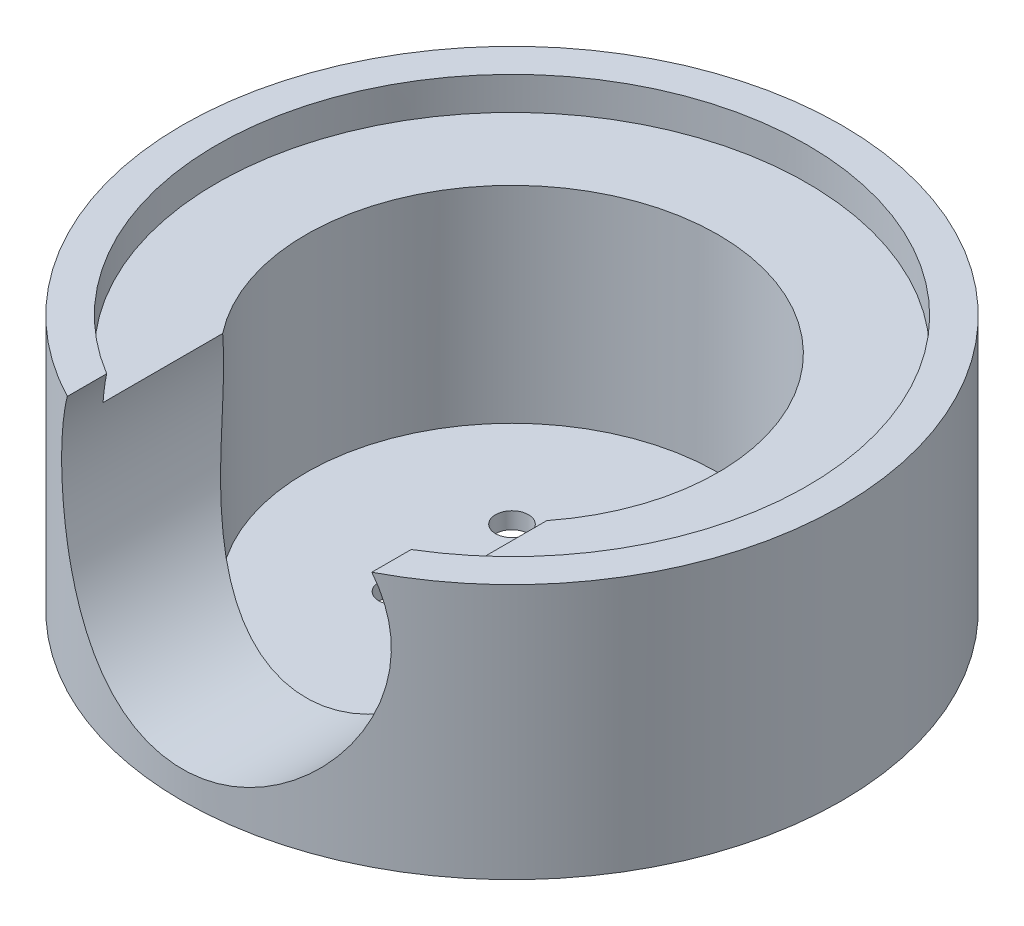
ISO-10303-21;
HEADER;
FILE_DESCRIPTION(('STEP AP214'),'2;1');
FILE_NAME('part.step','',(''),(''),'','','');
FILE_SCHEMA(('AUTOMOTIVE_DESIGN { 1 0 10303 214 1 1 1 1 }'));
ENDSEC;
DATA;
#1=APPLICATION_CONTEXT('core data for automotive mechanical design processes');
#2=APPLICATION_PROTOCOL_DEFINITION('international standard','automotive_design',2000,#1);
#3=PRODUCT_CONTEXT('',#1,'mechanical');
#4=PRODUCT('Part','Part','',(#3));
#5=PRODUCT_RELATED_PRODUCT_CATEGORY('part','',(#4));
#6=PRODUCT_DEFINITION_FORMATION('','',#4);
#7=PRODUCT_DEFINITION_CONTEXT('part definition',#1,'design');
#8=PRODUCT_DEFINITION('design','',#6,#7);
#9=PRODUCT_DEFINITION_SHAPE('','',#8);
#10=(LENGTH_UNIT() NAMED_UNIT(*) SI_UNIT(.MILLI.,.METRE.));
#11=(NAMED_UNIT(*) PLANE_ANGLE_UNIT() SI_UNIT($,.RADIAN.));
#12=(NAMED_UNIT(*) SI_UNIT($,.STERADIAN.) SOLID_ANGLE_UNIT());
#13=UNCERTAINTY_MEASURE_WITH_UNIT(LENGTH_MEASURE(1.E-05),#10,'distance_accuracy_value','');
#14=(GEOMETRIC_REPRESENTATION_CONTEXT(3) GLOBAL_UNCERTAINTY_ASSIGNED_CONTEXT((#13)) GLOBAL_UNIT_ASSIGNED_CONTEXT((#10,
#11,#12)) REPRESENTATION_CONTEXT('',''));
#15=CARTESIAN_POINT('',(0.,0.,0.));
#16=DIRECTION('',(0.,0.,1.));
#17=DIRECTION('',(1.,0.,0.));
#18=AXIS2_PLACEMENT_3D('',#15,#16,#17);
#19=CARTESIAN_POINT('',(0.,0.,0.));
#20=DIRECTION('',(0.,1.,0.));
#21=DIRECTION('',(0.,0.,1.));
#22=AXIS2_PLACEMENT_3D('',#19,#20,#21);
#23=PLANE('',#22);
#24=CARTESIAN_POINT('',(-4.24264068711928,0.,4.24264068711928));
#25=DIRECTION('',(0.,1.,0.));
#26=DIRECTION('',(0.,0.,1.));
#27=AXIS2_PLACEMENT_3D('',#24,#25,#26);
#28=CIRCLE('',#27,1.2);
#29=CARTESIAN_POINT('',(-4.24264068711928,0.,5.44264068711928));
#30=VERTEX_POINT('',#29);
#31=EDGE_CURVE('E123',#30,#30,#28,.T.);
#32=ORIENTED_EDGE('',*,*,#31,.T.);
#33=EDGE_LOOP('',(#32));
#34=FACE_BOUND('',#33,.T.);
#35=CARTESIAN_POINT('',(4.24264068711928,0.,4.24264068711928));
#36=DIRECTION('',(0.,1.,0.));
#37=DIRECTION('',(0.,0.,1.));
#38=AXIS2_PLACEMENT_3D('',#35,#36,#37);
#39=CIRCLE('',#38,1.2);
#40=CARTESIAN_POINT('',(4.24264068711928,0.,5.44264068711928));
#41=VERTEX_POINT('',#40);
#42=EDGE_CURVE('E128',#41,#41,#39,.T.);
#43=ORIENTED_EDGE('',*,*,#42,.T.);
#44=EDGE_LOOP('',(#43));
#45=FACE_BOUND('',#44,.T.);
#46=CARTESIAN_POINT('',(-4.24264068711928,0.,-4.24264068711928));
#47=DIRECTION('',(0.,1.,0.));
#48=DIRECTION('',(0.,0.,1.));
#49=AXIS2_PLACEMENT_3D('',#46,#47,#48);
#50=CIRCLE('',#49,1.2);
#51=CARTESIAN_POINT('',(-4.24264068711928,0.,-3.04264068711929));
#52=VERTEX_POINT('',#51);
#53=EDGE_CURVE('E139',#52,#52,#50,.T.);
#54=ORIENTED_EDGE('',*,*,#53,.T.);
#55=EDGE_LOOP('',(#54));
#56=FACE_BOUND('',#55,.T.);
#57=CARTESIAN_POINT('',(4.24264068711928,0.,-4.24264068711928));
#58=DIRECTION('',(0.,1.,0.));
#59=DIRECTION('',(0.,0.,1.));
#60=AXIS2_PLACEMENT_3D('',#57,#58,#59);
#61=CIRCLE('',#60,1.2);
#62=CARTESIAN_POINT('',(4.24264068711928,0.,-3.04264068711929));
#63=VERTEX_POINT('',#62);
#64=EDGE_CURVE('E147',#63,#63,#61,.T.);
#65=ORIENTED_EDGE('',*,*,#64,.T.);
#66=EDGE_LOOP('',(#65));
#67=FACE_BOUND('',#66,.T.);
#68=CARTESIAN_POINT('',(0.,0.,0.));
#69=DIRECTION('',(0.,-1.,0.));
#70=DIRECTION('',(0.,0.,-1.));
#71=AXIS2_PLACEMENT_3D('',#68,#69,#70);
#72=CIRCLE('',#71,19.);
#73=CARTESIAN_POINT('',(0.,0.,-19.));
#74=VERTEX_POINT('',#73);
#75=EDGE_CURVE('E249',#74,#74,#72,.T.);
#76=ORIENTED_EDGE('',*,*,#75,.T.);
#77=EDGE_LOOP('',(#76));
#78=FACE_BOUND('',#77,.T.);
#79=ADVANCED_FACE('F44',(#34,#45,#56,#67,#78),#23,.F.);
#80=CARTESIAN_POINT('',(0.,16.2,0.));
#81=DIRECTION('',(0.,1.,0.));
#82=DIRECTION('',(0.,0.,1.));
#83=AXIS2_PLACEMENT_3D('',#80,#81,#82);
#84=PLANE('',#83);
#85=DIRECTION('',(0.,0.,1.));
#86=VECTOR('',#85,1.);
#87=CARTESIAN_POINT('',(-11.7966096824469,16.2,4.));
#88=LINE('',#87,#86);
#89=CARTESIAN_POINT('',(-11.7966096824469,16.2,9.26498785752037));
#90=VERTEX_POINT('',#89);
#91=CARTESIAN_POINT('',(-11.7966096824469,16.2,17.9747044481961));
#92=VERTEX_POINT('',#91);
#93=EDGE_CURVE('E70',#90,#92,#88,.T.);
#94=ORIENTED_EDGE('',*,*,#93,.F.);
#95=CARTESIAN_POINT('',(0.,16.2,0.));
#96=DIRECTION('',(0.,1.,0.));
#97=DIRECTION('',(0.,0.,1.));
#98=AXIS2_PLACEMENT_3D('',#95,#96,#97);
#99=CIRCLE('',#98,15.);
#100=CARTESIAN_POINT('',(11.7966096824469,16.2,9.26498785752037));
#101=VERTEX_POINT('',#100);
#102=EDGE_CURVE('E116',#101,#90,#99,.T.);
#103=ORIENTED_EDGE('',*,*,#102,.F.);
#104=DIRECTION('',(0.,0.,1.));
#105=VECTOR('',#104,1.);
#106=CARTESIAN_POINT('',(11.7966096824469,16.2,4.));
#107=LINE('',#106,#105);
#108=CARTESIAN_POINT('',(11.7966096824469,16.2,17.9747044481961));
#109=VERTEX_POINT('',#108);
#110=EDGE_CURVE('E115',#109,#101,#107,.F.);
#111=ORIENTED_EDGE('',*,*,#110,.F.);
#112=CARTESIAN_POINT('',(0.,16.2,0.));
#113=DIRECTION('',(0.,1.,0.));
#114=DIRECTION('',(0.,0.,1.));
#115=AXIS2_PLACEMENT_3D('',#112,#113,#114);
#116=CIRCLE('',#115,21.5);
#117=EDGE_CURVE('E96',#92,#109,#116,.F.);
#118=ORIENTED_EDGE('',*,*,#117,.F.);
#119=EDGE_LOOP('',(#94,#103,#111,#118));
#120=FACE_BOUND('',#119,.T.);
#121=ADVANCED_FACE('F201',(#120),#84,.T.);
#122=CARTESIAN_POINT('',(0.,1.2,0.));
#123=DIRECTION('',(0.,1.,0.));
#124=DIRECTION('',(0.,0.,1.));
#125=AXIS2_PLACEMENT_3D('',#122,#123,#124);
#126=PLANE('',#125);
#127=CARTESIAN_POINT('',(-4.24264068711928,1.2,4.24264068711928));
#128=DIRECTION('',(0.,1.,0.));
#129=DIRECTION('',(0.,0.,1.));
#130=AXIS2_PLACEMENT_3D('',#127,#128,#129);
#131=CIRCLE('',#130,1.2);
#132=CARTESIAN_POINT('',(-4.24264068711928,1.2,5.44264068711928));
#133=VERTEX_POINT('',#132);
#134=EDGE_CURVE('E127',#133,#133,#131,.T.);
#135=ORIENTED_EDGE('',*,*,#134,.F.);
#136=EDGE_LOOP('',(#135));
#137=FACE_BOUND('',#136,.T.);
#138=CARTESIAN_POINT('',(-4.24264068711928,1.2,-4.24264068711928));
#139=DIRECTION('',(0.,1.,0.));
#140=DIRECTION('',(0.,0.,1.));
#141=AXIS2_PLACEMENT_3D('',#138,#139,#140);
#142=CIRCLE('',#141,1.2);
#143=CARTESIAN_POINT('',(-4.24264068711928,1.2,-3.04264068711929));
#144=VERTEX_POINT('',#143);
#145=EDGE_CURVE('E145',#144,#144,#142,.T.);
#146=ORIENTED_EDGE('',*,*,#145,.F.);
#147=EDGE_LOOP('',(#146));
#148=FACE_BOUND('',#147,.T.);
#149=CARTESIAN_POINT('',(4.24264068711928,1.2,-4.24264068711928));
#150=DIRECTION('',(0.,1.,0.));
#151=DIRECTION('',(0.,0.,1.));
#152=AXIS2_PLACEMENT_3D('',#149,#150,#151);
#153=CIRCLE('',#152,1.2);
#154=CARTESIAN_POINT('',(4.24264068711928,1.2,-3.04264068711929));
#155=VERTEX_POINT('',#154);
#156=EDGE_CURVE('E148',#155,#155,#153,.T.);
#157=ORIENTED_EDGE('',*,*,#156,.F.);
#158=EDGE_LOOP('',(#157));
#159=FACE_BOUND('',#158,.T.);
#160=CARTESIAN_POINT('',(4.24264068711928,1.2,4.24264068711928));
#161=DIRECTION('',(0.,1.,0.));
#162=DIRECTION('',(0.,0.,1.));
#163=AXIS2_PLACEMENT_3D('',#160,#161,#162);
#164=CIRCLE('',#163,1.2);
#165=CARTESIAN_POINT('',(4.24264068711928,1.2,5.44264068711928));
#166=VERTEX_POINT('',#165);
#167=EDGE_CURVE('E133',#166,#166,#164,.T.);
#168=ORIENTED_EDGE('',*,*,#167,.F.);
#169=EDGE_LOOP('',(#168));
#170=FACE_BOUND('',#169,.T.);
#171=CARTESIAN_POINT('',(0.,1.2,0.));
#172=DIRECTION('',(0.,1.,0.));
#173=DIRECTION('',(0.,0.,1.));
#174=AXIS2_PLACEMENT_3D('',#171,#172,#173);
#175=CIRCLE('',#174,15.);
#176=CARTESIAN_POINT('',(0.,1.2,15.));
#177=VERTEX_POINT('',#176);
#178=EDGE_CURVE('E163',#177,#177,#175,.F.);
#179=ORIENTED_EDGE('',*,*,#178,.F.);
#180=EDGE_LOOP('',(#179));
#181=FACE_BOUND('',#180,.T.);
#182=ADVANCED_FACE('F210',(#137,#148,#159,#170,#181),#126,.T.);
#183=CARTESIAN_POINT('',(0.,0.,0.));
#184=DIRECTION('',(0.,-1.,0.));
#185=DIRECTION('',(0.,0.,-1.));
#186=AXIS2_PLACEMENT_3D('',#183,#184,#185);
#187=CIRCLE('',#186,20.);
#188=CARTESIAN_POINT('',(0.,0.,-20.));
#189=VERTEX_POINT('',#188);
#190=EDGE_CURVE('E260',#189,#189,#187,.T.);
#191=ORIENTED_EDGE('',*,*,#190,.F.);
#192=EDGE_LOOP('',(#191));
#193=FACE_BOUND('',#192,.T.);
#194=CARTESIAN_POINT('',(0.,0.,0.));
#195=DIRECTION('',(0.,1.,0.));
#196=DIRECTION('',(0.,0.,1.));
#197=AXIS2_PLACEMENT_3D('',#194,#195,#196);
#198=CIRCLE('',#197,24.);
#199=CARTESIAN_POINT('',(0.,0.,24.));
#200=VERTEX_POINT('',#199);
#201=EDGE_CURVE('E153',#200,#200,#198,.T.);
#202=ORIENTED_EDGE('',*,*,#201,.F.);
#203=EDGE_LOOP('',(#202));
#204=FACE_BOUND('',#203,.T.);
#205=ADVANCED_FACE('F223',(#193,#204),#23,.F.);
#206=CARTESIAN_POINT('',(0.,1.2,0.));
#207=DIRECTION('',(0.,-1.,0.));
#208=DIRECTION('',(0.,0.,-1.));
#209=AXIS2_PLACEMENT_3D('',#206,#207,#208);
#210=CYLINDRICAL_SURFACE('',#209,24.);
#211=ORIENTED_EDGE('',*,*,#201,.T.);
#212=EDGE_LOOP('',(#211));
#213=FACE_BOUND('',#212,.T.);
#214=CARTESIAN_POINT('',(0.,18.6,0.));
#215=DIRECTION('',(0.,1.,0.));
#216=DIRECTION('',(0.,0.,1.));
#217=AXIS2_PLACEMENT_3D('',#214,#215,#216);
#218=CIRCLE('',#217,24.);
#219=CARTESIAN_POINT('',(11.0833208019979,18.6,21.2875550498407));
#220=VERTEX_POINT('',#219);
#221=CARTESIAN_POINT('',(-11.0833208019979,18.6,21.2875550498407));
#222=VERTEX_POINT('',#221);
#223=EDGE_CURVE('E102',#220,#222,#218,.T.);
#224=ORIENTED_EDGE('',*,*,#223,.F.);
#225=CARTESIAN_POINT('',(11.0833208019979,18.6,21.2875550498407));
#226=CARTESIAN_POINT('',(11.1970244557131,18.3261122643757,21.2283322597258));
#227=CARTESIAN_POINT('',(11.3008579055262,18.0471859478185,21.1731345702951));
#228=CARTESIAN_POINT('',(11.487971481082,17.4807125003222,21.0722113917843));
#229=CARTESIAN_POINT('',(11.5712417435088,17.1931613062549,21.0264904499932));
#230=CARTESIAN_POINT('',(11.7162845177026,16.6112439711941,20.946013891137));
#231=CARTESIAN_POINT('',(11.7780632453862,16.3168798269986,20.9112551038011));
#232=CARTESIAN_POINT('',(11.8794400638934,15.7232361591465,20.8538324366272));
#233=CARTESIAN_POINT('',(11.9190422341114,15.423957549942,20.8311663323673));
#234=CARTESIAN_POINT('',(11.9756741437059,14.821600315694,20.7986610665074));
#235=CARTESIAN_POINT('',(11.9926312724159,14.5185125974126,20.788863168086));
#236=CARTESIAN_POINT('',(12.0035113301073,13.911766613792,20.7825830445358));
#237=CARTESIAN_POINT('',(11.9974328942063,13.6081083157108,20.786101608422));
#238=CARTESIAN_POINT('',(11.9623381685398,13.0028737906318,20.8063180210309));
#239=CARTESIAN_POINT('',(11.9333448922832,12.7012957807531,20.823002646974));
#240=CARTESIAN_POINT('',(11.852828812059,12.1021528734258,20.8689383071883));
#241=CARTESIAN_POINT('',(11.801306473882,11.8045878931387,20.898189081653));
#242=CARTESIAN_POINT('',(11.6781869892019,11.2241481409339,20.9672309181471));
#243=CARTESIAN_POINT('',(11.6072239017473,10.9410985985102,21.0066871702643));
#244=CARTESIAN_POINT('',(11.4453796452044,10.3822652899988,21.0953017340055));
#245=CARTESIAN_POINT('',(11.3544915137956,10.1064841014881,21.1444634363635));
#246=CARTESIAN_POINT('',(11.0530511788569,9.29203094542062,21.3045086863495));
#247=CARTESIAN_POINT('',(10.8137173185586,8.76622282023769,21.4279557452925));
#248=CARTESIAN_POINT('',(10.2393332164356,7.71110326752024,21.70868508706));
#249=CARTESIAN_POINT('',(9.89740252879308,7.18610454892774,21.8680566542023));
#250=CARTESIAN_POINT('',(9.32822221708918,6.44476472247295,22.1139588458477));
#251=CARTESIAN_POINT('',(9.12899266016922,6.20522833336016,22.1971135236028));
#252=CARTESIAN_POINT('',(8.7125279683947,5.74235310606471,22.3638575345806));
#253=CARTESIAN_POINT('',(8.49529013973564,5.51901670059292,22.4474469310725));
#254=CARTESIAN_POINT('',(8.01925237345074,5.06630452022484,22.6221722030942));
#255=CARTESIAN_POINT('',(7.75850165628553,4.83891269008451,22.7131403269385));
#256=CARTESIAN_POINT('',(7.21753314828806,4.40693092909676,22.8907891260391));
#257=CARTESIAN_POINT('',(6.93732220289053,4.20233304542051,22.9774712907626));
#258=CARTESIAN_POINT('',(6.35877756326696,3.81733334816318,23.1442560300259));
#259=CARTESIAN_POINT('',(6.06043993239415,3.63693681797511,23.224357166388));
#260=CARTESIAN_POINT('',(5.4474481129274,3.30199690467356,23.3757341719309));
#261=CARTESIAN_POINT('',(5.13279488607168,3.14745199997584,23.4470105604576));
#262=CARTESIAN_POINT('',(4.496897733423,2.86916585712556,23.5771224110577));
#263=CARTESIAN_POINT('',(4.17598948415711,2.74477839574151,23.6362138389508));
#264=CARTESIAN_POINT('',(3.52284704058958,2.52357150653168,23.7423458285371));
#265=CARTESIAN_POINT('',(3.19061288779339,2.42675197769127,23.789386434387));
#266=CARTESIAN_POINT('',(2.51770660923145,2.26198275010714,23.869978737577));
#267=CARTESIAN_POINT('',(2.17704088023317,2.19401183486142,23.9035403469671));
#268=CARTESIAN_POINT('',(1.49001112326403,2.08779410212217,23.956178933592));
#269=CARTESIAN_POINT('',(1.14364769315582,2.04954418605036,23.9752574207675));
#270=CARTESIAN_POINT('',(0.483346375031776,2.00564204480193,23.9971731766974));
#271=CARTESIAN_POINT('',(0.169644309930473,1.99710261126828,24.0014487323774));
#272=CARTESIAN_POINT('',(-0.457376458057709,2.00462223792755,23.9976888662778));
#273=CARTESIAN_POINT('',(-0.770695188170394,2.02067943584715,23.9896543765229));
#274=CARTESIAN_POINT('',(-1.39453551719751,2.07719145405841,23.9614850886438));
#275=CARTESIAN_POINT('',(-1.70505738458762,2.11764390672037,23.9413514647761));
#276=CARTESIAN_POINT('',(-2.32105047276768,2.22246481032962,23.8895010837746));
#277=CARTESIAN_POINT('',(-2.6265216503972,2.28683346554151,23.8577842277101));
#278=CARTESIAN_POINT('',(-3.22100942844886,2.43642984906376,23.7847017071017));
#279=CARTESIAN_POINT('',(-3.5102432879574,2.5209566135538,23.7436621180258));
#280=CARTESIAN_POINT('',(-4.08022281384625,2.7109774967566,23.6523801677724));
#281=CARTESIAN_POINT('',(-4.36096874992711,2.81647094845239,23.6021380993589));
#282=CARTESIAN_POINT('',(-4.91244261400342,3.04749865574695,23.4935500439979));
#283=CARTESIAN_POINT('',(-5.18317083215386,3.17303233033654,23.435204292));
#284=CARTESIAN_POINT('',(-5.71339048253284,3.44321328611324,23.311613263179));
#285=CARTESIAN_POINT('',(-5.97287758004607,3.58786785496199,23.2463653575997));
#286=CARTESIAN_POINT('',(-6.49771600610271,3.90640719961823,23.1053838581867));
#287=CARTESIAN_POINT('',(-6.76213129930241,4.08165011189513,23.0292331001104));
#288=CARTESIAN_POINT('',(-7.27548542193262,4.45183204799383,22.8722409156178));
#289=CARTESIAN_POINT('',(-7.52441724402812,4.64677988637736,22.7913973969443));
#290=CARTESIAN_POINT('',(-8.00570210363596,5.05525866795189,22.6268301452837));
#291=CARTESIAN_POINT('',(-8.23804814844671,5.26879736596861,22.5431052192628));
#292=CARTESIAN_POINT('',(-8.68504892879132,5.71330660322398,22.3746950977226));
#293=CARTESIAN_POINT('',(-8.89970291003286,5.94427788488874,22.2900098614357));
#294=CARTESIAN_POINT('',(-9.32935627628716,6.44475639977051,22.1138393190136));
#295=CARTESIAN_POINT('',(-9.5425495083622,6.71585180362012,22.0224499255468));
#296=CARTESIAN_POINT('',(-9.94538655627374,7.27628083744891,21.8434861519041));
#297=CARTESIAN_POINT('',(-10.1350260315682,7.56561781426129,21.7559124768225));
#298=CARTESIAN_POINT('',(-10.4893759001213,8.16107599061222,21.5872997364509));
#299=CARTESIAN_POINT('',(-10.6540824077358,8.4671997961652,21.5062616906147));
#300=CARTESIAN_POINT('',(-10.9569966752357,9.09434912513934,21.3535243665905));
#301=CARTESIAN_POINT('',(-11.0952183254192,9.41536672698973,21.2818201995012));
#302=CARTESIAN_POINT('',(-11.3412651706978,10.0638200068379,21.1517068214661));
#303=CARTESIAN_POINT('',(-11.4496468147073,10.3909959567314,21.0930587965239));
#304=CARTESIAN_POINT('',(-11.6382710274822,11.0555278883763,20.9895747916731));
#305=CARTESIAN_POINT('',(-11.7185137393218,11.3928838183574,20.9447387415367));
#306=CARTESIAN_POINT('',(-11.8496091386789,12.0746131032642,20.8708514607749));
#307=CARTESIAN_POINT('',(-11.9004923985203,12.4189787704853,20.8417838122322));
#308=CARTESIAN_POINT('',(-11.9721491922879,13.1118141719006,20.8007063098446));
#309=CARTESIAN_POINT('',(-11.9929277972516,13.4602832049232,20.7886935831569));
#310=CARTESIAN_POINT('',(-12.0033327987695,14.1138056420342,20.7826847007877));
#311=CARTESIAN_POINT('',(-11.9965587385828,14.4187898363328,20.7866067153194));
#312=CARTESIAN_POINT('',(-11.9598590562654,15.0269094540738,20.8077444208917));
#313=CARTESIAN_POINT('',(-11.929933170772,15.3300448564458,20.8249602631559));
#314=CARTESIAN_POINT('',(-11.8473399467752,15.9320531020712,20.8720574132435));
#315=CARTESIAN_POINT('',(-11.7946819970583,16.2309276525513,20.9019334920484));
#316=CARTESIAN_POINT('',(-11.6672840678295,16.8224027730041,20.9733115628319));
#317=CARTESIAN_POINT('',(-11.5925523055162,17.1150056342787,21.0148092282604));
#318=CARTESIAN_POINT('',(-11.4468579498525,17.6075930428646,21.094410626967));
#319=CARTESIAN_POINT('',(-11.3812085860172,17.8095912533181,21.1299452303968));
#320=CARTESIAN_POINT('',(-11.2397862738359,18.2085501634604,21.2055079011493));
#321=CARTESIAN_POINT('',(-11.1640399727817,18.4055225502524,21.2455240979203));
#322=CARTESIAN_POINT('',(-11.0833208019979,18.6,21.2875550498407));
#323=B_SPLINE_CURVE_WITH_KNOTS('',3,(#225,#226,#227,#228,#229,#230,#231,#232,#233,#234,#235,
#236,#237,#238,#239,#240,#241,#242,#243,#244,#245,#246,#247,#248,#249,#250,#251,#252,#253,#254,
#255,#256,#257,#258,#259,#260,#261,#262,#263,#264,#265,#266,#267,#268,#269,#270,#271,#272,#273,
#274,#275,#276,#277,#278,#279,#280,#281,#282,#283,#284,#285,#286,#287,#288,#289,#290,#291,#292,
#293,#294,#295,#296,#297,#298,#299,#300,#301,#302,#303,#304,#305,#306,#307,#308,#309,#310,#311,
#312,#313,#314,#315,#316,#317,#318,#319,#320,#321,#322),.UNSPECIFIED.,.F.,.F.,(4,2,2,2,2,2,2,2,
2,2,2,2,2,2,2,2,2,2,2,2,2,2,2,2,2,2,2,2,2,2,2,2,2,2,2,2,2,2,2,2,2,2,2,2,2,2,2,2,4),(0.,
0.907091595218439,1.81461744355453,2.72188059291853,3.62897679567902,4.53897464768264,
5.44902641890055,6.35816537938686,7.26728554422639,8.14970410530466,9.03243149888334,
10.7978050395264,12.7290492228371,13.6957095718236,14.6625147825323,15.7344469721721,
16.8060039846186,17.8777945491239,18.9495220075823,19.9957132595884,21.0419006780836,
22.0873173468283,23.1326250104833,24.0729852334899,25.0132742629591,25.9534720493546,
26.8936778660196,27.8050222644733,28.7163376748039,29.6276266689364,30.5392639950396,
31.5169164137233,32.4950081154166,33.4735097824998,34.4520531459583,35.5211482956652,
36.5904401693591,37.6598985141963,38.7287944243967,39.7761485753356,40.8234974008555,
41.869753632939,42.9158336058498,43.8299360877138,44.7440489680667,45.6577846626156,
46.5711806376301,47.2169071180298,47.8609619798736),.UNSPECIFIED.);
#324=EDGE_CURVE('E110',#220,#222,#323,.T.);
#325=ORIENTED_EDGE('',*,*,#324,.T.);
#326=EDGE_LOOP('',(#224,#325));
#327=FACE_BOUND('',#326,.T.);
#328=ADVANCED_FACE('F50',(#213,#327),#210,.T.);
#329=CARTESIAN_POINT('',(4.24264068711928,1.2,-4.24264068711928));
#330=DIRECTION('',(0.,-1.,0.));
#331=DIRECTION('',(0.,0.,-1.));
#332=AXIS2_PLACEMENT_3D('',#329,#330,#331);
#333=CYLINDRICAL_SURFACE('',#332,1.2);
#334=ORIENTED_EDGE('',*,*,#156,.T.);
#335=EDGE_LOOP('',(#334));
#336=FACE_BOUND('',#335,.T.);
#337=ORIENTED_EDGE('',*,*,#64,.F.);
#338=EDGE_LOOP('',(#337));
#339=FACE_BOUND('',#338,.T.);
#340=ADVANCED_FACE('F218',(#336,#339),#333,.F.);
#341=CARTESIAN_POINT('',(-4.24264068711928,1.2,-4.24264068711928));
#342=DIRECTION('',(0.,-1.,0.));
#343=DIRECTION('',(0.,0.,-1.));
#344=AXIS2_PLACEMENT_3D('',#341,#342,#343);
#345=CYLINDRICAL_SURFACE('',#344,1.2);
#346=ORIENTED_EDGE('',*,*,#145,.T.);
#347=EDGE_LOOP('',(#346));
#348=FACE_BOUND('',#347,.T.);
#349=ORIENTED_EDGE('',*,*,#53,.F.);
#350=EDGE_LOOP('',(#349));
#351=FACE_BOUND('',#350,.T.);
#352=ADVANCED_FACE('F213',(#348,#351),#345,.F.);
#353=CARTESIAN_POINT('',(4.24264068711928,1.2,4.24264068711928));
#354=DIRECTION('',(0.,-1.,0.));
#355=DIRECTION('',(0.,0.,-1.));
#356=AXIS2_PLACEMENT_3D('',#353,#354,#355);
#357=CYLINDRICAL_SURFACE('',#356,1.2);
#358=ORIENTED_EDGE('',*,*,#167,.T.);
#359=EDGE_LOOP('',(#358));
#360=FACE_BOUND('',#359,.T.);
#361=ORIENTED_EDGE('',*,*,#42,.F.);
#362=EDGE_LOOP('',(#361));
#363=FACE_BOUND('',#362,.T.);
#364=ADVANCED_FACE('F212',(#360,#363),#357,.F.);
#365=CARTESIAN_POINT('',(-4.24264068711928,1.2,4.24264068711928));
#366=DIRECTION('',(0.,-1.,0.));
#367=DIRECTION('',(0.,0.,-1.));
#368=AXIS2_PLACEMENT_3D('',#365,#366,#367);
#369=CYLINDRICAL_SURFACE('',#368,1.2);
#370=ORIENTED_EDGE('',*,*,#134,.T.);
#371=EDGE_LOOP('',(#370));
#372=FACE_BOUND('',#371,.T.);
#373=ORIENTED_EDGE('',*,*,#31,.F.);
#374=EDGE_LOOP('',(#373));
#375=FACE_BOUND('',#374,.T.);
#376=ADVANCED_FACE('F205',(#372,#375),#369,.F.);
#377=CARTESIAN_POINT('',(0.,16.2,0.));
#378=DIRECTION('',(0.,-1.,0.));
#379=DIRECTION('',(0.,0.,-1.));
#380=AXIS2_PLACEMENT_3D('',#377,#378,#379);
#381=CYLINDRICAL_SURFACE('',#380,15.);
#382=CARTESIAN_POINT('',(11.7966096824469,16.2,9.26498785752037));
#383=CARTESIAN_POINT('',(11.8380769295872,15.977893608381,9.21213770659438));
#384=CARTESIAN_POINT('',(11.8735102386237,15.7528503219647,9.16633889541567));
#385=CARTESIAN_POINT('',(11.9317387107694,15.2983989531094,9.0904440299559));
#386=CARTESIAN_POINT('',(11.9545262938686,15.068988337857,9.06035739438951));
#387=CARTESIAN_POINT('',(11.9866571816961,14.6102197005173,9.01779890438192));
#388=CARTESIAN_POINT('',(11.9961512633622,14.3808910831434,9.00512953112334));
#389=CARTESIAN_POINT('',(12.0019391902903,13.9218540199727,8.99741624895129));
#390=CARTESIAN_POINT('',(11.9982378032258,13.6921457413301,9.00236597405559));
#391=CARTESIAN_POINT('',(11.9777101845898,13.233648193493,9.02965881541196));
#392=CARTESIAN_POINT('',(11.960842906151,13.0048640516528,9.05205632762202));
#393=CARTESIAN_POINT('',(11.9143489716749,12.550711101689,9.11316353845029));
#394=CARTESIAN_POINT('',(11.8847154522684,12.3253441983002,9.15188201127982));
#395=CARTESIAN_POINT('',(11.8132638973667,11.8791617642196,9.24392660612751));
#396=CARTESIAN_POINT('',(11.7714226010236,11.658355792105,9.29728060313384));
#397=CARTESIAN_POINT('',(11.6762996119934,11.2226283802671,9.41646629668332));
#398=CARTESIAN_POINT('',(11.6230138133515,11.0077090837969,9.48230247047226));
#399=CARTESIAN_POINT('',(11.4803523823299,10.492791664689,9.65499174856121));
#400=CARTESIAN_POINT('',(11.385332662618,10.1961719504254,9.76727387096808));
#401=CARTESIAN_POINT('',(11.1750303390164,9.6166416384761,10.0072051680322));
#402=CARTESIAN_POINT('',(11.0597375111999,9.33373805023923,10.134862086066));
#403=CARTESIAN_POINT('',(10.8099103047718,8.78099489227815,10.4009238639412));
#404=CARTESIAN_POINT('',(10.6753341315746,8.51118544883382,10.5393517629171));
#405=CARTESIAN_POINT('',(10.3880057194848,7.98508844501115,10.8226639271759));
#406=CARTESIAN_POINT('',(10.2352561334987,7.72879891889598,10.9675472481868));
#407=CARTESIAN_POINT('',(9.90337296873297,7.21609196829914,11.2683641589788));
#408=CARTESIAN_POINT('',(9.7232617026274,6.96041045246151,11.4244727357897));
#409=CARTESIAN_POINT('',(9.34372656578551,6.46392632512113,11.7369166521982));
#410=CARTESIAN_POINT('',(9.14430136013145,6.22312474395875,11.8932520067332));
#411=CARTESIAN_POINT('',(8.72654678312045,5.7571128740962,12.2030710883003));
#412=CARTESIAN_POINT('',(8.50823789031463,5.53188616064784,12.3565576905503));
#413=CARTESIAN_POINT('',(8.05267829231034,5.09756246079686,12.6581590816661));
#414=CARTESIAN_POINT('',(7.81542895681918,4.88846431017869,12.8062742578503));
#415=CARTESIAN_POINT('',(7.33418439516839,4.4973084651258,13.0875359618025));
#416=CARTESIAN_POINT('',(7.09107810321304,4.31443032605017,13.2210601373061));
#417=CARTESIAN_POINT('',(6.58826442896165,3.9656409749254,13.4786699716754));
#418=CARTESIAN_POINT('',(6.32855932340823,3.79972744404175,13.6027569198879));
#419=CARTESIAN_POINT('',(5.7932721938164,3.48648003252023,13.8392036641536));
#420=CARTESIAN_POINT('',(5.51769888963034,3.33913608687483,13.9515698073259));
#421=CARTESIAN_POINT('',(4.95154975920831,3.06468756759547,14.1623917197743));
#422=CARTESIAN_POINT('',(4.66097663132249,2.93757937039566,14.2608499791443));
#423=CARTESIAN_POINT('',(4.11369649012648,2.72394057609702,14.4272582433915));
#424=CARTESIAN_POINT('',(3.85896855463439,2.63417152689062,14.4975696848934));
#425=CARTESIAN_POINT('',(3.34116325525787,2.47132909156502,14.625584367045));
#426=CARTESIAN_POINT('',(3.07808748212795,2.39825254604374,14.6832899935159));
#427=CARTESIAN_POINT('',(2.5451668263157,2.26981630743204,14.784981266362));
#428=CARTESIAN_POINT('',(2.27532524702775,2.21444814315132,14.8289734725947));
#429=CARTESIAN_POINT('',(1.73052187696048,2.12222181183681,14.9023767964259));
#430=CARTESIAN_POINT('',(1.45556003012363,2.08536384757943,14.9317877542891));
#431=CARTESIAN_POINT('',(0.901590317454041,2.0306699176289,14.975466267027));
#432=CARTESIAN_POINT('',(0.622571824783783,2.01289948739538,14.9896816483564));
#433=CARTESIAN_POINT('',(0.0636135009022208,1.99691189936506,15.0024698199663));
#434=CARTESIAN_POINT('',(-0.216326332356344,1.99869478504598,15.0010425754646));
#435=CARTESIAN_POINT('',(-0.774897806453841,2.02178322819387,14.9825775314699));
#436=CARTESIAN_POINT('',(-1.05352934845788,2.04309023749867,14.9655385710705));
#437=CARTESIAN_POINT('',(-1.60728358216169,2.10486426220315,14.9162296923426));
#438=CARTESIAN_POINT('',(-1.8824063466623,2.1453308794091,14.8839600905523));
#439=CARTESIAN_POINT('',(-2.41296851387184,2.24217327449906,14.8069468888764));
#440=CARTESIAN_POINT('',(-2.66868749304634,2.29761229483866,14.7629392406793));
#441=CARTESIAN_POINT('',(-3.17368279201109,2.4243570871688,14.6626739126977));
#442=CARTESIAN_POINT('',(-3.42295938784431,2.49566217806832,14.6064167587563));
#443=CARTESIAN_POINT('',(-3.91382617937568,2.65326394029687,14.4826117149391));
#444=CARTESIAN_POINT('',(-4.15541645328428,2.73956045902622,14.4150639399923));
#445=CARTESIAN_POINT('',(-4.62999629480896,2.92623879722198,14.2697146518421));
#446=CARTESIAN_POINT('',(-4.86298267914076,3.02662576524209,14.1919093912578));
#447=CARTESIAN_POINT('',(-5.34204269977483,3.25107978598533,14.0190464594595));
#448=CARTESIAN_POINT('',(-5.58713798590082,3.37650616904531,13.9230439081414));
#449=CARTESIAN_POINT('',(-6.06526594967961,3.64203814866396,13.7215122023532));
#450=CARTESIAN_POINT('',(-6.29829358074732,3.78214981358284,13.6159791121159));
#451=CARTESIAN_POINT('',(-6.75172343725165,4.07592734263696,13.396926244972));
#452=CARTESIAN_POINT('',(-6.97212428079471,4.22959468566859,13.2834055969135));
#453=CARTESIAN_POINT('',(-7.39998931063165,4.54952211612372,13.0498879859076));
#454=CARTESIAN_POINT('',(-7.60745174992721,4.71578389741858,12.9298901524463));
#455=CARTESIAN_POINT('',(-8.05086164375575,5.09575196715093,12.6595527695381));
#456=CARTESIAN_POINT('',(-8.28381107440274,5.31215330463001,12.5080759108984));
#457=CARTESIAN_POINT('',(-8.73041245168696,5.76105734197759,12.2005500689136));
#458=CARTESIAN_POINT('',(-8.94406112936645,5.99356275764747,12.0445003169654));
#459=CARTESIAN_POINT('',(-9.35217975985481,6.47429091467578,11.7304354226541));
#460=CARTESIAN_POINT('',(-9.54662212611995,6.72253544641202,11.5724178101025));
#461=CARTESIAN_POINT('',(-9.91573960258074,7.2340861871345,11.2577481104672));
#462=CARTESIAN_POINT('',(-10.0904172868452,7.49739042806789,11.1010958480244));
#463=CARTESIAN_POINT('',(-10.4015833922319,8.00944696234881,10.8095982199051));
#464=CARTESIAN_POINT('',(-10.5401591136473,8.25664039791811,10.6742419116706));
#465=CARTESIAN_POINT('',(-10.8007991010515,8.76321832418286,10.4104326766836));
#466=CARTESIAN_POINT('',(-10.9228615881169,9.02260412427752,10.2819804945896));
#467=CARTESIAN_POINT('',(-11.1493513672248,9.55309665987155,10.0359282418143));
#468=CARTESIAN_POINT('',(-11.2538208339419,9.82417334991823,9.91830253384284));
#469=CARTESIAN_POINT('',(-11.4442663780524,10.3785940004939,9.69793657882299));
#470=CARTESIAN_POINT('',(-11.5302509248602,10.6619322712225,9.59518952175328));
#471=CARTESIAN_POINT('',(-11.6596743945266,11.1546055416968,9.43711479541557));
#472=CARTESIAN_POINT('',(-11.7081716748116,11.3610034598815,9.37675571912122));
#473=CARTESIAN_POINT('',(-11.7946085614609,11.7790252250985,9.26779633165973));
#474=CARTESIAN_POINT('',(-11.8325515578451,11.9906473702838,9.21919224546388));
#475=CARTESIAN_POINT('',(-11.8972188724742,12.4179746981917,9.13558901962627));
#476=CARTESIAN_POINT('',(-11.9239585565988,12.6336738616306,9.10057125061124));
#477=CARTESIAN_POINT('',(-11.9657423783101,13.0680247520051,9.04556302971605));
#478=CARTESIAN_POINT('',(-11.9807920431036,13.2866750337966,9.02556547621324));
#479=CARTESIAN_POINT('',(-11.9991215307762,13.7316004671378,9.00118537023206));
#480=CARTESIAN_POINT('',(-12.0020546799572,13.9579157071237,8.99726277355105));
#481=CARTESIAN_POINT('',(-11.9951238559148,14.4100820356377,9.00649856407294));
#482=CARTESIAN_POINT('',(-11.9852551179738,14.6359329199961,9.01966331099302));
#483=CARTESIAN_POINT('',(-11.9527893560466,15.0874449271149,9.06264925962775));
#484=CARTESIAN_POINT('',(-11.930061867645,15.3130799760374,9.09264116259969));
#485=CARTESIAN_POINT('',(-11.8723674396067,15.7600875699363,9.16781774153658));
#486=CARTESIAN_POINT('',(-11.8374081390077,15.9814626845123,9.21299293450808));
#487=CARTESIAN_POINT('',(-11.7966096824469,16.2,9.26498785752037));
#488=B_SPLINE_CURVE_WITH_KNOTS('',3,(#382,#383,#384,#385,#386,#387,#388,#389,#390,#391,#392,
#393,#394,#395,#396,#397,#398,#399,#400,#401,#402,#403,#404,#405,#406,#407,#408,#409,#410,#411,
#412,#413,#414,#415,#416,#417,#418,#419,#420,#421,#422,#423,#424,#425,#426,#427,#428,#429,#430,
#431,#432,#433,#434,#435,#436,#437,#438,#439,#440,#441,#442,#443,#444,#445,#446,#447,#448,#449,
#450,#451,#452,#453,#454,#455,#456,#457,#458,#459,#460,#461,#462,#463,#464,#465,#466,#467,#468,
#469,#470,#471,#472,#473,#474,#475,#476,#477,#478,#479,#480,#481,#482,#483,#484,#485,#486,#487),
.UNSPECIFIED.,.F.,.F.,(4,2,2,2,2,2,2,2,2,2,2,2,2,2,2,2,2,2,2,2,2,2,2,2,2,2,2,2,2,2,2,2,2,2,2,2,
2,2,2,2,2,2,2,2,2,2,2,2,2,2,2,2,4),(0.,0.696120083309051,1.39265698044756,2.08122783005817,
2.7695499163832,3.46002657514962,4.15087491120384,4.8430482920542,5.53547042066594,
6.52717961313471,7.51939037617261,8.51378512523041,9.50803489288178,10.5558105997955,
11.6036587773685,12.6503845230384,13.6970346415716,14.6927926208081,15.6884143108187,
16.6834940158779,17.6783953335445,18.5148050789576,19.3510563850858,20.1869070517392,
21.0227668748087,21.8614874686076,22.7002099273415,23.5389947595709,24.3777621601181,
25.1729111769412,25.9680260665747,26.7631328631052,27.5585309462072,28.4324440248465,
29.3067196627809,30.1810908006159,31.0555797452817,32.1111619758043,33.1669226558196,
34.2241783512197,35.2812961952278,36.2227771100386,37.1643593672594,38.1036512635739,
39.0425118738674,39.7032987202514,40.3638730771741,41.0235384351084,41.6828917037466,
42.3609847966105,43.0393303404839,43.7246850517287,44.4096125055078),.UNSPECIFIED.);
#489=EDGE_CURVE('E117',#101,#90,#488,.T.);
#490=ORIENTED_EDGE('',*,*,#489,.F.);
#491=ORIENTED_EDGE('',*,*,#102,.T.);
#492=EDGE_LOOP('',(#490,#491));
#493=FACE_BOUND('',#492,.T.);
#494=ORIENTED_EDGE('',*,*,#178,.T.);
#495=EDGE_LOOP('',(#494));
#496=FACE_BOUND('',#495,.T.);
#497=ADVANCED_FACE('F200',(#493,#496),#381,.F.);
#498=CARTESIAN_POINT('',(0.,18.6,0.));
#499=DIRECTION('',(0.,1.,0.));
#500=DIRECTION('',(0.,0.,1.));
#501=AXIS2_PLACEMENT_3D('',#498,#499,#500);
#502=PLANE('',#501);
#503=DIRECTION('',(0.,0.,1.));
#504=VECTOR('',#503,1.);
#505=CARTESIAN_POINT('',(-11.0833208019979,18.6,4.));
#506=LINE('',#505,#504);
#507=CARTESIAN_POINT('',(-11.0833208019979,18.6,18.4230833467148));
#508=VERTEX_POINT('',#507);
#509=EDGE_CURVE('E92',#508,#222,#506,.T.);
#510=ORIENTED_EDGE('',*,*,#509,.F.);
#511=CARTESIAN_POINT('',(0.,18.6,0.));
#512=DIRECTION('',(0.,1.,0.));
#513=DIRECTION('',(0.,0.,1.));
#514=AXIS2_PLACEMENT_3D('',#511,#512,#513);
#515=CIRCLE('',#514,21.5);
#516=CARTESIAN_POINT('',(11.0833208019979,18.6,18.4230833467148));
#517=VERTEX_POINT('',#516);
#518=EDGE_CURVE('E101',#517,#508,#515,.T.);
#519=ORIENTED_EDGE('',*,*,#518,.F.);
#520=DIRECTION('',(0.,0.,1.));
#521=VECTOR('',#520,1.);
#522=CARTESIAN_POINT('',(11.0833208019979,18.6,4.));
#523=LINE('',#522,#521);
#524=EDGE_CURVE('E188',#220,#517,#523,.F.);
#525=ORIENTED_EDGE('',*,*,#524,.F.);
#526=ORIENTED_EDGE('',*,*,#223,.T.);
#527=EDGE_LOOP('',(#510,#519,#525,#526));
#528=FACE_BOUND('',#527,.T.);
#529=ADVANCED_FACE('F103',(#528),#502,.T.);
#530=CARTESIAN_POINT('',(0.,18.6,0.));
#531=DIRECTION('',(0.,-1.,0.));
#532=DIRECTION('',(0.,0.,-1.));
#533=AXIS2_PLACEMENT_3D('',#530,#531,#532);
#534=CYLINDRICAL_SURFACE('',#533,21.5);
#535=CARTESIAN_POINT('',(11.0833208019979,18.6,18.4230833467148));
#536=CARTESIAN_POINT('',(11.1628039010121,18.4085036685794,18.3752624052503));
#537=CARTESIAN_POINT('',(11.2375160680923,18.2144602951999,18.3296188349614));
#538=CARTESIAN_POINT('',(11.3768259783403,17.8224255723826,18.2434796616881));
#539=CARTESIAN_POINT('',(11.4414568017551,17.6244496456352,18.2029673074266));
#540=CARTESIAN_POINT('',(11.5605720024476,17.2243948475302,18.1275525196757));
#541=CARTESIAN_POINT('',(11.6150558690183,17.0223157702242,18.0926503685658));
#542=CARTESIAN_POINT('',(11.7137276513971,16.6139826890504,18.0289201806539));
#543=CARTESIAN_POINT('',(11.7578803068851,16.4077169253981,18.0001129769799));
#544=CARTESIAN_POINT('',(11.7966096824469,16.2,17.9747044481961));
#545=B_SPLINE_CURVE_WITH_KNOTS('',3,(#535,#536,#537,#538,#539,#540,#541,#542,#543,#544),
.UNSPECIFIED.,.F.,.F.,(4,2,2,2,4),(0.,0.638290145414703,1.27443966952552,1.91062120305851,
2.54894333905254),.UNSPECIFIED.);
#546=EDGE_CURVE('E11',#517,#109,#545,.T.);
#547=ORIENTED_EDGE('',*,*,#546,.F.);
#548=ORIENTED_EDGE('',*,*,#518,.T.);
#549=CARTESIAN_POINT('',(-11.7966096824469,16.2,17.9747044481961));
#550=CARTESIAN_POINT('',(-11.7578803068851,16.4077169253981,18.0001129769799));
#551=CARTESIAN_POINT('',(-11.7137276513971,16.6139826890504,18.0289201806539));
#552=CARTESIAN_POINT('',(-11.6150558690183,17.0223157702242,18.0926503685658));
#553=CARTESIAN_POINT('',(-11.5605720024475,17.2243948475302,18.1275525196757));
#554=CARTESIAN_POINT('',(-11.4414568017551,17.6244496456352,18.2029673074266));
#555=CARTESIAN_POINT('',(-11.3768259783403,17.8224255723826,18.2434796616881));
#556=CARTESIAN_POINT('',(-11.2375160680923,18.2144602951999,18.3296188349614));
#557=CARTESIAN_POINT('',(-11.1628039010121,18.4085036685794,18.3752624052503));
#558=CARTESIAN_POINT('',(-11.0833208019979,18.6,18.4230833467148));
#559=B_SPLINE_CURVE_WITH_KNOTS('',3,(#549,#550,#551,#552,#553,#554,#555,#556,#557,#558),
.UNSPECIFIED.,.F.,.F.,(4,2,2,2,4),(0.,0.638322135994024,1.27450366952702,1.91065319363783,
2.54894333905254),.UNSPECIFIED.);
#560=EDGE_CURVE('E62',#92,#508,#559,.T.);
#561=ORIENTED_EDGE('',*,*,#560,.F.);
#562=ORIENTED_EDGE('',*,*,#117,.T.);
#563=EDGE_LOOP('',(#547,#548,#561,#562));
#564=FACE_BOUND('',#563,.T.);
#565=ADVANCED_FACE('F109',(#564),#534,.F.);
#566=CARTESIAN_POINT('',(0.,14.,4.));
#567=DIRECTION('',(0.,0.,1.));
#568=DIRECTION('',(1.,0.,0.));
#569=AXIS2_PLACEMENT_3D('',#566,#567,#568);
#570=CYLINDRICAL_SURFACE('',#569,12.);
#571=ORIENTED_EDGE('',*,*,#546,.T.);
#572=ORIENTED_EDGE('',*,*,#110,.T.);
#573=ORIENTED_EDGE('',*,*,#489,.T.);
#574=ORIENTED_EDGE('',*,*,#93,.T.);
#575=ORIENTED_EDGE('',*,*,#560,.T.);
#576=ORIENTED_EDGE('',*,*,#509,.T.);
#577=ORIENTED_EDGE('',*,*,#324,.F.);
#578=ORIENTED_EDGE('',*,*,#524,.T.);
#579=EDGE_LOOP('',(#571,#572,#573,#574,#575,#576,#577,#578));
#580=FACE_BOUND('',#579,.T.);
#581=ADVANCED_FACE('F87',(#580),#570,.F.);
#582=CARTESIAN_POINT('',(0.,1.6,0.));
#583=DIRECTION('',(0.,-1.,0.));
#584=DIRECTION('',(0.,0.,-1.));
#585=AXIS2_PLACEMENT_3D('',#582,#583,#584);
#586=CYLINDRICAL_SURFACE('',#585,20.);
#587=CARTESIAN_POINT('',(0.,1.6,0.));
#588=DIRECTION('',(0.,-1.,0.));
#589=DIRECTION('',(0.,0.,-1.));
#590=AXIS2_PLACEMENT_3D('',#587,#588,#589);
#591=CIRCLE('',#590,20.);
#592=CARTESIAN_POINT('',(0.,1.6,-20.));
#593=VERTEX_POINT('',#592);
#594=EDGE_CURVE('E108',#593,#593,#591,.T.);
#595=ORIENTED_EDGE('',*,*,#594,.F.);
#596=EDGE_LOOP('',(#595));
#597=FACE_BOUND('',#596,.T.);
#598=ORIENTED_EDGE('',*,*,#190,.T.);
#599=EDGE_LOOP('',(#598));
#600=FACE_BOUND('',#599,.T.);
#601=ADVANCED_FACE('F174',(#597,#600),#586,.F.);
#602=CARTESIAN_POINT('',(0.,1.6,0.));
#603=DIRECTION('',(0.,-1.,0.));
#604=DIRECTION('',(0.,0.,-1.));
#605=AXIS2_PLACEMENT_3D('',#602,#603,#604);
#606=PLANE('',#605);
#607=CARTESIAN_POINT('',(0.,1.6,0.));
#608=DIRECTION('',(0.,-1.,0.));
#609=DIRECTION('',(0.,0.,-1.));
#610=AXIS2_PLACEMENT_3D('',#607,#608,#609);
#611=CIRCLE('',#610,19.);
#612=CARTESIAN_POINT('',(0.,1.6,-19.));
#613=VERTEX_POINT('',#612);
#614=EDGE_CURVE('E254',#613,#613,#611,.T.);
#615=ORIENTED_EDGE('',*,*,#614,.F.);
#616=EDGE_LOOP('',(#615));
#617=FACE_BOUND('',#616,.T.);
#618=ORIENTED_EDGE('',*,*,#594,.T.);
#619=EDGE_LOOP('',(#618));
#620=FACE_BOUND('',#619,.T.);
#621=ADVANCED_FACE('F262',(#617,#620),#606,.T.);
#622=CARTESIAN_POINT('',(0.,1.6,0.));
#623=DIRECTION('',(0.,-1.,0.));
#624=DIRECTION('',(0.,0.,-1.));
#625=AXIS2_PLACEMENT_3D('',#622,#623,#624);
#626=CYLINDRICAL_SURFACE('',#625,19.);
#627=ORIENTED_EDGE('',*,*,#614,.T.);
#628=EDGE_LOOP('',(#627));
#629=FACE_BOUND('',#628,.T.);
#630=ORIENTED_EDGE('',*,*,#75,.F.);
#631=EDGE_LOOP('',(#630));
#632=FACE_BOUND('',#631,.T.);
#633=ADVANCED_FACE('F268',(#629,#632),#626,.T.);
#634=CLOSED_SHELL('',(#79,#121,#182,#205,#328,#340,#352,#364,#376,#497,#529,#565,#581,#601,#621,#633));
#635=MANIFOLD_SOLID_BREP('B2',#634);
#636=ADVANCED_BREP_SHAPE_REPRESENTATION('',(#18,#635),#14);
#637=SHAPE_DEFINITION_REPRESENTATION(#9,#636);
ENDSEC;
END-ISO-10303-21;
